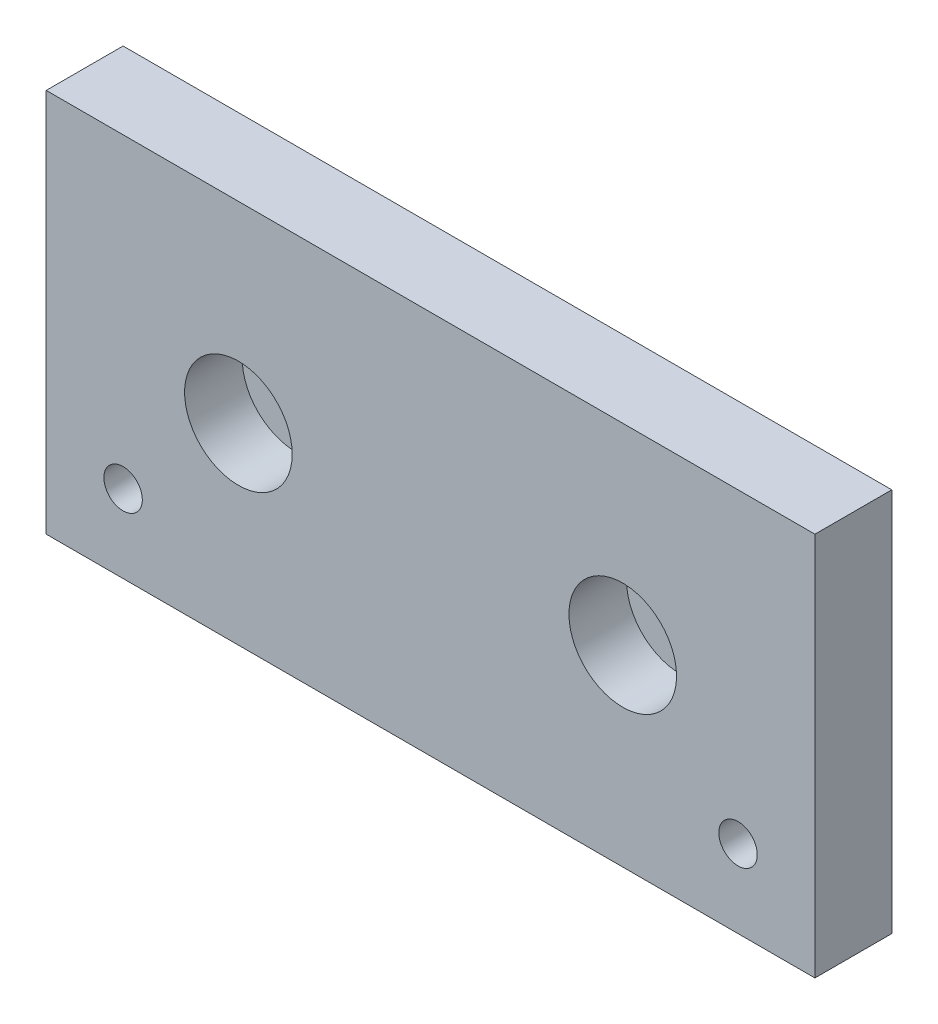
ISO-10303-21;
HEADER;
FILE_DESCRIPTION(('STEP AP214'),'2;1');
FILE_NAME('part.step','',(''),(''),'','','');
FILE_SCHEMA(('AUTOMOTIVE_DESIGN { 1 0 10303 214 1 1 1 1 }'));
ENDSEC;
DATA;
#1=APPLICATION_CONTEXT('core data for automotive mechanical design processes');
#2=APPLICATION_PROTOCOL_DEFINITION('international standard','automotive_design',2000,#1);
#3=PRODUCT_CONTEXT('',#1,'mechanical');
#4=PRODUCT('Part','Part','',(#3));
#5=PRODUCT_RELATED_PRODUCT_CATEGORY('part','',(#4));
#6=PRODUCT_DEFINITION_FORMATION('','',#4);
#7=PRODUCT_DEFINITION_CONTEXT('part definition',#1,'design');
#8=PRODUCT_DEFINITION('design','',#6,#7);
#9=PRODUCT_DEFINITION_SHAPE('','',#8);
#10=(LENGTH_UNIT() NAMED_UNIT(*) SI_UNIT(.MILLI.,.METRE.));
#11=(NAMED_UNIT(*) PLANE_ANGLE_UNIT() SI_UNIT($,.RADIAN.));
#12=(NAMED_UNIT(*) SI_UNIT($,.STERADIAN.) SOLID_ANGLE_UNIT());
#13=UNCERTAINTY_MEASURE_WITH_UNIT(LENGTH_MEASURE(1.E-05),#10,'distance_accuracy_value','');
#14=(GEOMETRIC_REPRESENTATION_CONTEXT(3) GLOBAL_UNCERTAINTY_ASSIGNED_CONTEXT((#13)) GLOBAL_UNIT_ASSIGNED_CONTEXT((#10,
#11,#12)) REPRESENTATION_CONTEXT('',''));
#15=CARTESIAN_POINT('',(0.,0.,0.));
#16=DIRECTION('',(0.,0.,1.));
#17=DIRECTION('',(1.,0.,0.));
#18=AXIS2_PLACEMENT_3D('',#15,#16,#17);
#19=CARTESIAN_POINT('',(-100.,50.,20.));
#20=DIRECTION('',(1.,0.,0.));
#21=DIRECTION('',(0.,1.,0.));
#22=AXIS2_PLACEMENT_3D('',#19,#20,#21);
#23=PLANE('',#22);
#24=DIRECTION('',(0.,-1.,0.));
#25=VECTOR('',#24,1.);
#26=CARTESIAN_POINT('',(-100.,50.,0.));
#27=LINE('',#26,#25);
#28=CARTESIAN_POINT('',(-100.,50.,0.));
#29=VERTEX_POINT('',#28);
#30=CARTESIAN_POINT('',(-100.,-50.,0.));
#31=VERTEX_POINT('',#30);
#32=EDGE_CURVE('E100',#29,#31,#27,.T.);
#33=ORIENTED_EDGE('',*,*,#32,.T.);
#34=DIRECTION('',(0.,0.,-1.));
#35=VECTOR('',#34,1.);
#36=CARTESIAN_POINT('',(-100.,-50.,20.));
#37=LINE('',#36,#35);
#38=CARTESIAN_POINT('',(-100.,-50.,20.));
#39=VERTEX_POINT('',#38);
#40=EDGE_CURVE('E11',#39,#31,#37,.T.);
#41=ORIENTED_EDGE('',*,*,#40,.F.);
#42=DIRECTION('',(0.,-1.,0.));
#43=VECTOR('',#42,1.);
#44=CARTESIAN_POINT('',(-100.,50.,20.));
#45=LINE('',#44,#43);
#46=CARTESIAN_POINT('',(-100.,50.,20.));
#47=VERTEX_POINT('',#46);
#48=EDGE_CURVE('E88',#47,#39,#45,.T.);
#49=ORIENTED_EDGE('',*,*,#48,.F.);
#50=DIRECTION('',(0.,0.,-1.));
#51=VECTOR('',#50,1.);
#52=CARTESIAN_POINT('',(-100.,50.,20.));
#53=LINE('',#52,#51);
#54=EDGE_CURVE('E96',#47,#29,#53,.T.);
#55=ORIENTED_EDGE('',*,*,#54,.T.);
#56=EDGE_LOOP('',(#33,#41,#49,#55));
#57=FACE_BOUND('',#56,.T.);
#58=ADVANCED_FACE('F37',(#57),#23,.F.);
#59=CARTESIAN_POINT('',(100.,-50.,20.));
#60=DIRECTION('',(0.,1.,0.));
#61=DIRECTION('',(-1.,0.,0.));
#62=AXIS2_PLACEMENT_3D('',#59,#60,#61);
#63=PLANE('',#62);
#64=DIRECTION('',(1.,0.,0.));
#65=VECTOR('',#64,1.);
#66=CARTESIAN_POINT('',(100.,-50.,0.));
#67=LINE('',#66,#65);
#68=CARTESIAN_POINT('',(100.,-50.,0.));
#69=VERTEX_POINT('',#68);
#70=EDGE_CURVE('E92',#31,#69,#67,.T.);
#71=ORIENTED_EDGE('',*,*,#70,.T.);
#72=DIRECTION('',(0.,0.,-1.));
#73=VECTOR('',#72,1.);
#74=CARTESIAN_POINT('',(100.,-50.,20.));
#75=LINE('',#74,#73);
#76=CARTESIAN_POINT('',(100.,-50.,20.));
#77=VERTEX_POINT('',#76);
#78=EDGE_CURVE('E45',#77,#69,#75,.T.);
#79=ORIENTED_EDGE('',*,*,#78,.F.);
#80=DIRECTION('',(1.,0.,0.));
#81=VECTOR('',#80,1.);
#82=CARTESIAN_POINT('',(100.,-50.,20.));
#83=LINE('',#82,#81);
#84=EDGE_CURVE('E83',#39,#77,#83,.T.);
#85=ORIENTED_EDGE('',*,*,#84,.F.);
#86=ORIENTED_EDGE('',*,*,#40,.T.);
#87=EDGE_LOOP('',(#71,#79,#85,#86));
#88=FACE_BOUND('',#87,.T.);
#89=ADVANCED_FACE('F91',(#88),#63,.F.);
#90=CARTESIAN_POINT('',(100.,50.,20.));
#91=DIRECTION('',(-1.,0.,0.));
#92=DIRECTION('',(0.,0.,1.));
#93=AXIS2_PLACEMENT_3D('',#90,#91,#92);
#94=PLANE('',#93);
#95=DIRECTION('',(0.,1.,0.));
#96=VECTOR('',#95,1.);
#97=CARTESIAN_POINT('',(100.,50.,0.));
#98=LINE('',#97,#96);
#99=CARTESIAN_POINT('',(100.,50.,0.));
#100=VERTEX_POINT('',#99);
#101=EDGE_CURVE('E70',#69,#100,#98,.T.);
#102=ORIENTED_EDGE('',*,*,#101,.T.);
#103=DIRECTION('',(0.,0.,-1.));
#104=VECTOR('',#103,1.);
#105=CARTESIAN_POINT('',(100.,50.,20.));
#106=LINE('',#105,#104);
#107=CARTESIAN_POINT('',(100.,50.,20.));
#108=VERTEX_POINT('',#107);
#109=EDGE_CURVE('E93',#108,#100,#106,.T.);
#110=ORIENTED_EDGE('',*,*,#109,.F.);
#111=DIRECTION('',(0.,1.,0.));
#112=VECTOR('',#111,1.);
#113=CARTESIAN_POINT('',(100.,50.,20.));
#114=LINE('',#113,#112);
#115=EDGE_CURVE('E86',#77,#108,#114,.T.);
#116=ORIENTED_EDGE('',*,*,#115,.F.);
#117=ORIENTED_EDGE('',*,*,#78,.T.);
#118=EDGE_LOOP('',(#102,#110,#116,#117));
#119=FACE_BOUND('',#118,.T.);
#120=ADVANCED_FACE('F94',(#119),#94,.F.);
#121=CARTESIAN_POINT('',(100.,50.,20.));
#122=DIRECTION('',(0.,-1.,0.));
#123=DIRECTION('',(1.,0.,0.));
#124=AXIS2_PLACEMENT_3D('',#121,#122,#123);
#125=PLANE('',#124);
#126=DIRECTION('',(-1.,0.,0.));
#127=VECTOR('',#126,1.);
#128=CARTESIAN_POINT('',(100.,50.,0.));
#129=LINE('',#128,#127);
#130=EDGE_CURVE('E76',#100,#29,#129,.T.);
#131=ORIENTED_EDGE('',*,*,#130,.T.);
#132=ORIENTED_EDGE('',*,*,#54,.F.);
#133=DIRECTION('',(-1.,0.,0.));
#134=VECTOR('',#133,1.);
#135=CARTESIAN_POINT('',(100.,50.,20.));
#136=LINE('',#135,#134);
#137=EDGE_CURVE('E53',#108,#47,#136,.T.);
#138=ORIENTED_EDGE('',*,*,#137,.F.);
#139=ORIENTED_EDGE('',*,*,#109,.T.);
#140=EDGE_LOOP('',(#131,#132,#138,#139));
#141=FACE_BOUND('',#140,.T.);
#142=ADVANCED_FACE('F108',(#141),#125,.F.);
#143=CARTESIAN_POINT('',(0.,0.,20.));
#144=DIRECTION('',(0.,0.,-1.));
#145=DIRECTION('',(-1.,0.,0.));
#146=AXIS2_PLACEMENT_3D('',#143,#144,#145);
#147=PLANE('',#146);
#148=CARTESIAN_POINT('',(80.0000000000001,-29.7500000000001,20.));
#149=DIRECTION('',(0.,0.,-1.));
#150=DIRECTION('',(-1.,0.,0.));
#151=AXIS2_PLACEMENT_3D('',#148,#149,#150);
#152=CIRCLE('',#151,5.);
#153=CARTESIAN_POINT('',(75.0000000000001,-29.7500000000001,20.));
#154=VERTEX_POINT('',#153);
#155=EDGE_CURVE('E118',#154,#154,#152,.T.);
#156=ORIENTED_EDGE('',*,*,#155,.T.);
#157=EDGE_LOOP('',(#156));
#158=FACE_BOUND('',#157,.T.);
#159=CARTESIAN_POINT('',(-80.,-29.7500000000001,20.));
#160=DIRECTION('',(0.,0.,-1.));
#161=DIRECTION('',(-1.,0.,0.));
#162=AXIS2_PLACEMENT_3D('',#159,#160,#161);
#163=CIRCLE('',#162,5.);
#164=CARTESIAN_POINT('',(-85.,-29.7500000000001,20.));
#165=VERTEX_POINT('',#164);
#166=EDGE_CURVE('E129',#165,#165,#163,.T.);
#167=ORIENTED_EDGE('',*,*,#166,.T.);
#168=EDGE_LOOP('',(#167));
#169=FACE_BOUND('',#168,.T.);
#170=CARTESIAN_POINT('',(-50.,0.,20.));
#171=DIRECTION('',(0.,0.,1.));
#172=DIRECTION('',(1.,0.,0.));
#173=AXIS2_PLACEMENT_3D('',#170,#171,#172);
#174=CIRCLE('',#173,14.);
#175=CARTESIAN_POINT('',(-36.,0.,20.));
#176=VERTEX_POINT('',#175);
#177=EDGE_CURVE('E121',#176,#176,#174,.T.);
#178=ORIENTED_EDGE('',*,*,#177,.F.);
#179=EDGE_LOOP('',(#178));
#180=FACE_BOUND('',#179,.T.);
#181=CARTESIAN_POINT('',(50.,0.,20.));
#182=DIRECTION('',(0.,0.,1.));
#183=DIRECTION('',(-1.,0.,0.));
#184=AXIS2_PLACEMENT_3D('',#181,#182,#183);
#185=CIRCLE('',#184,14.);
#186=CARTESIAN_POINT('',(36.,0.,20.));
#187=VERTEX_POINT('',#186);
#188=EDGE_CURVE('E114',#187,#187,#185,.T.);
#189=ORIENTED_EDGE('',*,*,#188,.F.);
#190=EDGE_LOOP('',(#189));
#191=FACE_BOUND('',#190,.T.);
#192=ORIENTED_EDGE('',*,*,#48,.T.);
#193=ORIENTED_EDGE('',*,*,#84,.T.);
#194=ORIENTED_EDGE('',*,*,#115,.T.);
#195=ORIENTED_EDGE('',*,*,#137,.T.);
#196=EDGE_LOOP('',(#192,#193,#194,#195));
#197=FACE_BOUND('',#196,.T.);
#198=ADVANCED_FACE('F84',(#158,#169,#180,#191,#197),#147,.F.);
#199=CARTESIAN_POINT('',(0.,0.,0.));
#200=DIRECTION('',(0.,0.,-1.));
#201=DIRECTION('',(-1.,0.,0.));
#202=AXIS2_PLACEMENT_3D('',#199,#200,#201);
#203=PLANE('',#202);
#204=CARTESIAN_POINT('',(80.0000000000001,-29.7500000000001,0.));
#205=DIRECTION('',(0.,0.,-1.));
#206=DIRECTION('',(-1.,0.,0.));
#207=AXIS2_PLACEMENT_3D('',#204,#205,#206);
#208=CIRCLE('',#207,5.);
#209=CARTESIAN_POINT('',(75.0000000000001,-29.7500000000001,0.));
#210=VERTEX_POINT('',#209);
#211=EDGE_CURVE('E132',#210,#210,#208,.T.);
#212=ORIENTED_EDGE('',*,*,#211,.F.);
#213=EDGE_LOOP('',(#212));
#214=FACE_BOUND('',#213,.T.);
#215=CARTESIAN_POINT('',(-80.,-29.7500000000001,0.));
#216=DIRECTION('',(0.,0.,-1.));
#217=DIRECTION('',(-1.,0.,0.));
#218=AXIS2_PLACEMENT_3D('',#215,#216,#217);
#219=CIRCLE('',#218,5.);
#220=CARTESIAN_POINT('',(-85.,-29.7500000000001,0.));
#221=VERTEX_POINT('',#220);
#222=EDGE_CURVE('E126',#221,#221,#219,.T.);
#223=ORIENTED_EDGE('',*,*,#222,.F.);
#224=EDGE_LOOP('',(#223));
#225=FACE_BOUND('',#224,.T.);
#226=ORIENTED_EDGE('',*,*,#32,.F.);
#227=ORIENTED_EDGE('',*,*,#130,.F.);
#228=ORIENTED_EDGE('',*,*,#101,.F.);
#229=ORIENTED_EDGE('',*,*,#70,.F.);
#230=EDGE_LOOP('',(#226,#227,#228,#229));
#231=FACE_BOUND('',#230,.T.);
#232=ADVANCED_FACE('F111',(#214,#225,#231),#203,.T.);
#233=CARTESIAN_POINT('',(50.,0.,5.));
#234=DIRECTION('',(0.,0.,1.));
#235=DIRECTION('',(1.,0.,0.));
#236=AXIS2_PLACEMENT_3D('',#233,#234,#235);
#237=CYLINDRICAL_SURFACE('',#236,14.);
#238=CARTESIAN_POINT('',(50.,0.,5.));
#239=DIRECTION('',(0.,0.,1.));
#240=DIRECTION('',(-1.,0.,0.));
#241=AXIS2_PLACEMENT_3D('',#238,#239,#240);
#242=CIRCLE('',#241,14.);
#243=CARTESIAN_POINT('',(36.,0.,5.));
#244=VERTEX_POINT('',#243);
#245=EDGE_CURVE('E117',#244,#244,#242,.T.);
#246=ORIENTED_EDGE('',*,*,#245,.F.);
#247=EDGE_LOOP('',(#246));
#248=FACE_BOUND('',#247,.T.);
#249=ORIENTED_EDGE('',*,*,#188,.T.);
#250=EDGE_LOOP('',(#249));
#251=FACE_BOUND('',#250,.T.);
#252=ADVANCED_FACE('F149',(#248,#251),#237,.F.);
#253=CARTESIAN_POINT('',(50.,0.,5.));
#254=DIRECTION('',(0.,0.,-1.));
#255=DIRECTION('',(-1.,0.,0.));
#256=AXIS2_PLACEMENT_3D('',#253,#254,#255);
#257=PLANE('',#256);
#258=ORIENTED_EDGE('',*,*,#245,.T.);
#259=EDGE_LOOP('',(#258));
#260=FACE_BOUND('',#259,.T.);
#261=ADVANCED_FACE('F179',(#260),#257,.F.);
#262=CARTESIAN_POINT('',(-50.,0.,5.));
#263=DIRECTION('',(0.,0.,1.));
#264=DIRECTION('',(1.,0.,0.));
#265=AXIS2_PLACEMENT_3D('',#262,#263,#264);
#266=CYLINDRICAL_SURFACE('',#265,14.);
#267=CARTESIAN_POINT('',(-50.,0.,5.));
#268=DIRECTION('',(0.,0.,1.));
#269=DIRECTION('',(1.,0.,0.));
#270=AXIS2_PLACEMENT_3D('',#267,#268,#269);
#271=CIRCLE('',#270,14.);
#272=CARTESIAN_POINT('',(-36.,0.,5.));
#273=VERTEX_POINT('',#272);
#274=EDGE_CURVE('E103',#273,#273,#271,.T.);
#275=ORIENTED_EDGE('',*,*,#274,.F.);
#276=EDGE_LOOP('',(#275));
#277=FACE_BOUND('',#276,.T.);
#278=ORIENTED_EDGE('',*,*,#177,.T.);
#279=EDGE_LOOP('',(#278));
#280=FACE_BOUND('',#279,.T.);
#281=ADVANCED_FACE('F160',(#277,#280),#266,.F.);
#282=CARTESIAN_POINT('',(-50.,0.,5.));
#283=DIRECTION('',(0.,0.,1.));
#284=DIRECTION('',(1.,0.,0.));
#285=AXIS2_PLACEMENT_3D('',#282,#283,#284);
#286=PLANE('',#285);
#287=ORIENTED_EDGE('',*,*,#274,.T.);
#288=EDGE_LOOP('',(#287));
#289=FACE_BOUND('',#288,.T.);
#290=ADVANCED_FACE('F154',(#289),#286,.T.);
#291=CARTESIAN_POINT('',(-80.,-29.7500000000001,20.));
#292=DIRECTION('',(0.,0.,-1.));
#293=DIRECTION('',(-1.,0.,0.));
#294=AXIS2_PLACEMENT_3D('',#291,#292,#293);
#295=CYLINDRICAL_SURFACE('',#294,5.);
#296=ORIENTED_EDGE('',*,*,#166,.F.);
#297=EDGE_LOOP('',(#296));
#298=FACE_BOUND('',#297,.T.);
#299=ORIENTED_EDGE('',*,*,#222,.T.);
#300=EDGE_LOOP('',(#299));
#301=FACE_BOUND('',#300,.T.);
#302=ADVANCED_FACE('F143',(#298,#301),#295,.F.);
#303=CARTESIAN_POINT('',(80.0000000000001,-29.7500000000001,20.));
#304=DIRECTION('',(0.,0.,-1.));
#305=DIRECTION('',(-1.,0.,0.));
#306=AXIS2_PLACEMENT_3D('',#303,#304,#305);
#307=CYLINDRICAL_SURFACE('',#306,5.);
#308=ORIENTED_EDGE('',*,*,#155,.F.);
#309=EDGE_LOOP('',(#308));
#310=FACE_BOUND('',#309,.T.);
#311=ORIENTED_EDGE('',*,*,#211,.T.);
#312=EDGE_LOOP('',(#311));
#313=FACE_BOUND('',#312,.T.);
#314=ADVANCED_FACE('F140',(#310,#313),#307,.F.);
#315=CLOSED_SHELL('',(#58,#89,#120,#142,#198,#232,#252,#261,#281,#290,#302,#314));
#316=MANIFOLD_SOLID_BREP('B2',#315);
#317=ADVANCED_BREP_SHAPE_REPRESENTATION('',(#18,#316),#14);
#318=SHAPE_DEFINITION_REPRESENTATION(#9,#317);
ENDSEC;
END-ISO-10303-21;
